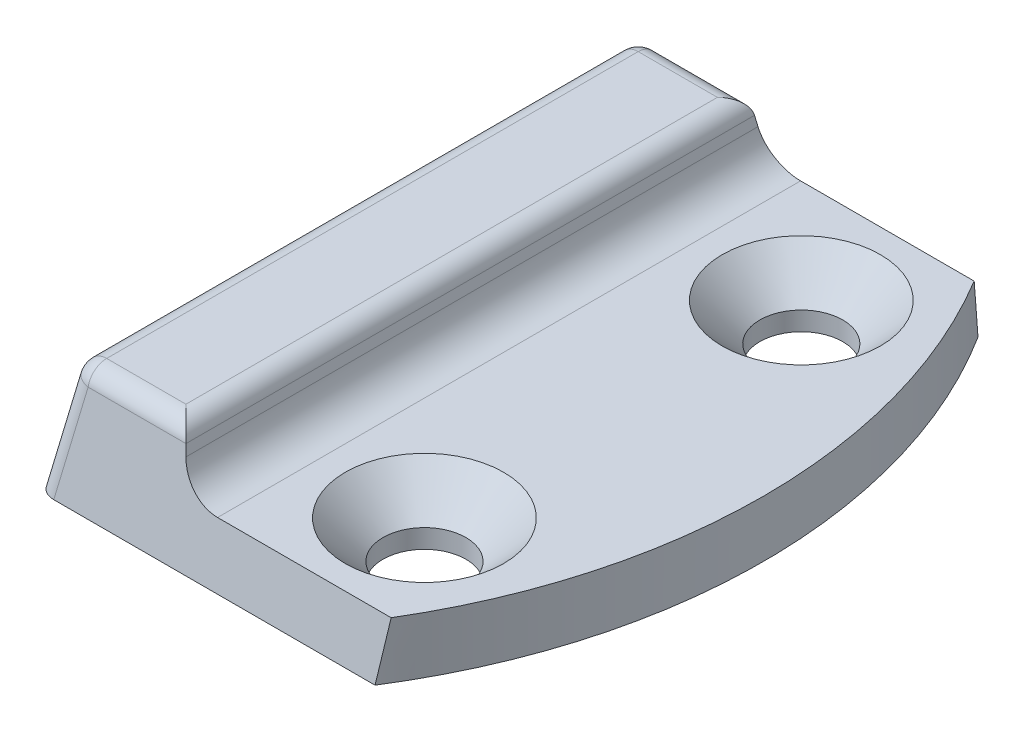
ISO-10303-21;
HEADER;
FILE_DESCRIPTION(('STEP AP214'),'2;1');
FILE_NAME('part.step','',(''),(''),'','','');
FILE_SCHEMA(('AUTOMOTIVE_DESIGN { 1 0 10303 214 1 1 1 1 }'));
ENDSEC;
DATA;
#1=APPLICATION_CONTEXT('core data for automotive mechanical design processes');
#2=APPLICATION_PROTOCOL_DEFINITION('international standard','automotive_design',2000,#1);
#3=PRODUCT_CONTEXT('',#1,'mechanical');
#4=PRODUCT('Part','Part','',(#3));
#5=PRODUCT_RELATED_PRODUCT_CATEGORY('part','',(#4));
#6=PRODUCT_DEFINITION_FORMATION('','',#4);
#7=PRODUCT_DEFINITION_CONTEXT('part definition',#1,'design');
#8=PRODUCT_DEFINITION('design','',#6,#7);
#9=PRODUCT_DEFINITION_SHAPE('','',#8);
#10=(LENGTH_UNIT() NAMED_UNIT(*) SI_UNIT(.MILLI.,.METRE.));
#11=(NAMED_UNIT(*) PLANE_ANGLE_UNIT() SI_UNIT($,.RADIAN.));
#12=(NAMED_UNIT(*) SI_UNIT($,.STERADIAN.) SOLID_ANGLE_UNIT());
#13=UNCERTAINTY_MEASURE_WITH_UNIT(LENGTH_MEASURE(1.E-05),#10,'distance_accuracy_value','');
#14=(GEOMETRIC_REPRESENTATION_CONTEXT(3) GLOBAL_UNCERTAINTY_ASSIGNED_CONTEXT((#13)) GLOBAL_UNIT_ASSIGNED_CONTEXT((#10,
#11,#12)) REPRESENTATION_CONTEXT('',''));
#15=CARTESIAN_POINT('',(0.,0.,0.));
#16=DIRECTION('',(0.,0.,1.));
#17=DIRECTION('',(1.,0.,0.));
#18=AXIS2_PLACEMENT_3D('',#15,#16,#17);
#19=CARTESIAN_POINT('',(7.67101905787461,1.5,-9.52313991782861));
#20=DIRECTION('',(0.,1.,0.));
#21=DIRECTION('',(0.,0.,1.));
#22=AXIS2_PLACEMENT_3D('',#19,#20,#21);
#23=PLANE('',#22);
#24=CARTESIAN_POINT('',(11.,1.5,5.));
#25=DIRECTION('',(0.,1.,0.));
#26=DIRECTION('',(0.,0.,1.));
#27=AXIS2_PLACEMENT_3D('',#24,#25,#26);
#28=CIRCLE('',#27,2.1);
#29=CARTESIAN_POINT('',(11.,1.5,7.1));
#30=VERTEX_POINT('',#29);
#31=EDGE_CURVE('E168',#30,#30,#28,.F.);
#32=ORIENTED_EDGE('',*,*,#31,.T.);
#33=EDGE_LOOP('',(#32));
#34=FACE_BOUND('',#33,.T.);
#35=CARTESIAN_POINT('',(11.,1.5,-5.));
#36=DIRECTION('',(0.,1.,0.));
#37=DIRECTION('',(0.,0.,1.));
#38=AXIS2_PLACEMENT_3D('',#35,#36,#37);
#39=CIRCLE('',#38,2.09999999999999);
#40=CARTESIAN_POINT('',(11.,1.5,-2.90000000000001));
#41=VERTEX_POINT('',#40);
#42=EDGE_CURVE('E165',#41,#41,#39,.F.);
#43=ORIENTED_EDGE('',*,*,#42,.T.);
#44=EDGE_LOOP('',(#43));
#45=FACE_BOUND('',#44,.T.);
#46=DIRECTION('',(-1.,0.,0.));
#47=VECTOR('',#46,1.);
#48=CARTESIAN_POINT('',(15.,1.5,-7.7355095289373));
#49=LINE('',#48,#47);
#50=CARTESIAN_POINT('',(12.8515326839922,1.5,-7.7355095289373));
#51=VERTEX_POINT('',#50);
#52=CARTESIAN_POINT('',(8.24562821798918,1.5,-7.7355095289373));
#53=VERTEX_POINT('',#52);
#54=EDGE_CURVE('E138',#51,#53,#49,.T.);
#55=ORIENTED_EDGE('',*,*,#54,.T.);
#56=DIRECTION('',(0.,0.,-1.));
#57=VECTOR('',#56,1.);
#58=CARTESIAN_POINT('',(8.24562821798918,1.5,-9.52313991782861));
#59=LINE('',#58,#57);
#60=CARTESIAN_POINT('',(8.24562821798919,1.5,7.7355095289373));
#61=VERTEX_POINT('',#60);
#62=EDGE_CURVE('E174',#53,#61,#59,.F.);
#63=ORIENTED_EDGE('',*,*,#62,.T.);
#64=DIRECTION('',(-1.,0.,0.));
#65=VECTOR('',#64,1.);
#66=CARTESIAN_POINT('',(15.,1.5,7.7355095289373));
#67=LINE('',#66,#65);
#68=CARTESIAN_POINT('',(12.8515326839922,1.5,7.7355095289373));
#69=VERTEX_POINT('',#68);
#70=EDGE_CURVE('E147',#69,#61,#67,.T.);
#71=ORIENTED_EDGE('',*,*,#70,.F.);
#72=CARTESIAN_POINT('',(0.,1.5,0.));
#73=DIRECTION('',(0.,1.,0.));
#74=DIRECTION('',(0.,0.,1.));
#75=AXIS2_PLACEMENT_3D('',#72,#73,#74);
#76=CIRCLE('',#75,15.);
#77=EDGE_CURVE('E132',#69,#51,#76,.T.);
#78=ORIENTED_EDGE('',*,*,#77,.T.);
#79=EDGE_LOOP('',(#55,#63,#71,#78));
#80=FACE_BOUND('',#79,.T.);
#81=ADVANCED_FACE('F39',(#34,#45,#80),#23,.T.);
#82=CARTESIAN_POINT('',(0.,1.5,0.));
#83=DIRECTION('',(0.,-1.,0.));
#84=DIRECTION('',(0.,0.,-1.));
#85=AXIS2_PLACEMENT_3D('',#82,#83,#84);
#86=CYLINDRICAL_SURFACE('',#85,15.);
#87=CARTESIAN_POINT('',(0.,45.3702545569409,0.));
#88=DIRECTION('',(0.,0.173648177666933,0.984807753012208));
#89=DIRECTION('',(0.,-0.984807753012208,0.173648177666933));
#90=AXIS2_PLACEMENT_3D('',#87,#88,#89);
#91=ELLIPSE('',#90,86.3815572471531,15.);
#92=CARTESIAN_POINT('',(12.6885775404495,0.,8.00000000000001));
#93=VERTEX_POINT('',#92);
#94=EDGE_CURVE('E142',#93,#69,#91,.T.);
#95=ORIENTED_EDGE('',*,*,#94,.F.);
#96=CARTESIAN_POINT('',(0.,0.,0.));
#97=DIRECTION('',(0.,1.,0.));
#98=DIRECTION('',(0.,0.,1.));
#99=AXIS2_PLACEMENT_3D('',#96,#97,#98);
#100=CIRCLE('',#99,15.);
#101=CARTESIAN_POINT('',(12.6885775404495,0.,-7.99999999999999));
#102=VERTEX_POINT('',#101);
#103=EDGE_CURVE('E127',#93,#102,#100,.T.);
#104=ORIENTED_EDGE('',*,*,#103,.T.);
#105=CARTESIAN_POINT('',(0.,45.3702545569415,0.));
#106=DIRECTION('',(0.,0.173648177666931,-0.984807753012208));
#107=DIRECTION('',(0.,-0.984807753012208,-0.173648177666931));
#108=AXIS2_PLACEMENT_3D('',#105,#106,#107);
#109=ELLIPSE('',#108,86.3815572471542,15.);
#110=EDGE_CURVE('E135',#51,#102,#109,.T.);
#111=ORIENTED_EDGE('',*,*,#110,.F.);
#112=ORIENTED_EDGE('',*,*,#77,.F.);
#113=EDGE_LOOP('',(#95,#104,#111,#112));
#114=FACE_BOUND('',#113,.T.);
#115=ADVANCED_FACE('F146',(#114),#86,.T.);
#116=CARTESIAN_POINT('',(7.6710190578746,0.,-7.99999999999999));
#117=DIRECTION('',(0.984807753012208,0.173648177666931,0.));
#118=DIRECTION('',(-0.173648177666931,0.984807753012208,0.));
#119=AXIS2_PLACEMENT_3D('',#116,#117,#118);
#120=PLANE('',#119);
#121=DIRECTION('',(0.171087869746036,-0.970287525247814,-0.171087869746036));
#122=VECTOR('',#121,1.);
#123=CARTESIAN_POINT('',(7.55393482117765,0.664017702943206,-7.88291576330305));
#124=LINE('',#123,#122);
#125=CARTESIAN_POINT('',(7.21489217666667,2.58682408883346,-7.54387311879206));
#126=VERTEX_POINT('',#125);
#127=CARTESIAN_POINT('',(7.26082046497697,2.32635182233307,-7.58980140710237));
#128=VERTEX_POINT('',#127);
#129=EDGE_CURVE('E143',#126,#128,#124,.T.);
#130=ORIENTED_EDGE('',*,*,#129,.F.);
#131=DIRECTION('',(0.,0.,-1.));
#132=VECTOR('',#131,1.);
#133=CARTESIAN_POINT('',(7.21489217666667,2.58682408883347,7.47101905787461));
#134=LINE('',#133,#132);
#135=CARTESIAN_POINT('',(7.21489217666667,2.58682408883347,7.54387311879207));
#136=VERTEX_POINT('',#135);
#137=EDGE_CURVE('E194',#126,#136,#134,.F.);
#138=ORIENTED_EDGE('',*,*,#137,.T.);
#139=DIRECTION('',(0.171087869746036,-0.970287525247814,0.171087869746036));
#140=VECTOR('',#139,1.);
#141=CARTESIAN_POINT('',(7.20268211108682,2.65607081177282,7.53166305321222));
#142=LINE('',#141,#140);
#143=CARTESIAN_POINT('',(7.26082046497698,2.32635182233307,7.58980140710238));
#144=VERTEX_POINT('',#143);
#145=EDGE_CURVE('E158',#136,#144,#142,.T.);
#146=ORIENTED_EDGE('',*,*,#145,.T.);
#147=DIRECTION('',(0.,0.,1.));
#148=VECTOR('',#147,1.);
#149=CARTESIAN_POINT('',(7.26082046497697,2.32635182233307,-7.99999999999999));
#150=LINE('',#149,#148);
#151=EDGE_CURVE('E177',#144,#128,#150,.F.);
#152=ORIENTED_EDGE('',*,*,#151,.T.);
#153=EDGE_LOOP('',(#130,#138,#146,#152));
#154=FACE_BOUND('',#153,.T.);
#155=ADVANCED_FACE('F279',(#154),#120,.T.);
#156=CARTESIAN_POINT('',(3.6710190578746,0.,-7.99999999999999));
#157=DIRECTION('',(0.,0.173648177666931,-0.984807753012208));
#158=DIRECTION('',(0.,0.984807753012208,0.173648177666931));
#159=AXIS2_PLACEMENT_3D('',#156,#157,#158);
#160=PLANE('',#159);
#161=DIRECTION('',(-1.,0.,0.));
#162=VECTOR('',#161,1.);
#163=CARTESIAN_POINT('',(3.6710190578746,0.,-7.99999999999999));
#164=LINE('',#163,#162);
#165=CARTESIAN_POINT('',(4.1634229343807,0.,-7.99999999999999));
#166=VERTEX_POINT('',#165);
#167=EDGE_CURVE('E122',#102,#166,#164,.T.);
#168=ORIENTED_EDGE('',*,*,#167,.T.);
#169=DIRECTION('',(0.171087869746036,0.970287525247814,0.171087869746036));
#170=VECTOR('',#169,1.);
#171=CARTESIAN_POINT('',(4.14900975137387,-0.0817412227494783,-8.01441318300683));
#172=LINE('',#171,#170);
#173=CARTESIAN_POINT('',(4.61954981558864,2.58682408883347,-7.54387311879206));
#174=VERTEX_POINT('',#173);
#175=EDGE_CURVE('E11',#166,#174,#172,.T.);
#176=ORIENTED_EDGE('',*,*,#175,.T.);
#177=DIRECTION('',(-1.,0.,0.));
#178=VECTOR('',#177,1.);
#179=CARTESIAN_POINT('',(7.14203811574921,2.58682408883347,-7.54387311879206));
#180=LINE('',#179,#178);
#181=EDGE_CURVE('E48',#174,#126,#180,.F.);
#182=ORIENTED_EDGE('',*,*,#181,.T.);
#183=ORIENTED_EDGE('',*,*,#129,.T.);
#184=CARTESIAN_POINT('',(8.24562821798918,2.5,-7.55918254822883));
#185=DIRECTION('',(0.,0.173648177666931,-0.984807753012208));
#186=DIRECTION('',(0.,-0.984807753012208,-0.173648177666931));
#187=AXIS2_PLACEMENT_3D('',#184,#185,#186);
#188=ELLIPSE('',#187,1.01542661188575,1.);
#189=EDGE_CURVE('E183',#128,#53,#188,.F.);
#190=ORIENTED_EDGE('',*,*,#189,.T.);
#191=ORIENTED_EDGE('',*,*,#54,.F.);
#192=ORIENTED_EDGE('',*,*,#110,.T.);
#193=EDGE_LOOP('',(#168,#176,#182,#183,#190,#191,#192));
#194=FACE_BOUND('',#193,.T.);
#195=ADVANCED_FACE('F136',(#194),#160,.T.);
#196=CARTESIAN_POINT('',(3.6710190578746,0.,-7.99999999999999));
#197=DIRECTION('',(-0.984807753012208,0.173648177666931,0.));
#198=DIRECTION('',(-0.173648177666931,-0.984807753012208,0.));
#199=AXIS2_PLACEMENT_3D('',#196,#197,#198);
#200=PLANE('',#199);
#201=DIRECTION('',(0.,0.,1.));
#202=VECTOR('',#201,1.);
#203=CARTESIAN_POINT('',(3.6710190578746,0.,-7.99999999999999));
#204=LINE('',#203,#202);
#205=CARTESIAN_POINT('',(3.6710190578746,0.,-7.50759612349389));
#206=VERTEX_POINT('',#205);
#207=CARTESIAN_POINT('',(3.67101905787461,0.,7.5075961234939));
#208=VERTEX_POINT('',#207);
#209=EDGE_CURVE('E131',#206,#208,#204,.T.);
#210=ORIENTED_EDGE('',*,*,#209,.T.);
#211=DIRECTION('',(0.171087869746036,0.970287525247814,-0.171087869746036));
#212=VECTOR('',#211,1.);
#213=CARTESIAN_POINT('',(4.12494282165556,2.57432958902334,7.05367235971295));
#214=LINE('',#213,#212);
#215=CARTESIAN_POINT('',(4.12714593908254,2.58682408883347,7.05146924228597));
#216=VERTEX_POINT('',#215);
#217=EDGE_CURVE('E207',#208,#216,#214,.T.);
#218=ORIENTED_EDGE('',*,*,#217,.T.);
#219=DIRECTION('',(0.,0.,1.));
#220=VECTOR('',#219,1.);
#221=CARTESIAN_POINT('',(4.12714593908253,2.58682408883347,-7.4710190578746));
#222=LINE('',#221,#220);
#223=CARTESIAN_POINT('',(4.12714593908253,2.58682408883347,-7.05146924228596));
#224=VERTEX_POINT('',#223);
#225=EDGE_CURVE('E62',#216,#224,#222,.F.);
#226=ORIENTED_EDGE('',*,*,#225,.T.);
#227=DIRECTION('',(0.171087869746036,0.970287525247814,0.171087869746036));
#228=VECTOR('',#227,1.);
#229=CARTESIAN_POINT('',(3.65660587486777,-0.0817412227494785,-7.52200930650072));
#230=LINE('',#229,#228);
#231=EDGE_CURVE('E205',#224,#206,#230,.F.);
#232=ORIENTED_EDGE('',*,*,#231,.T.);
#233=EDGE_LOOP('',(#210,#218,#226,#232));
#234=FACE_BOUND('',#233,.T.);
#235=ADVANCED_FACE('F254',(#234),#200,.T.);
#236=CARTESIAN_POINT('',(3.67101905787461,0.,8.00000000000001));
#237=DIRECTION('',(0.,0.173648177666931,0.984807753012208));
#238=DIRECTION('',(0.,-0.984807753012208,0.173648177666931));
#239=AXIS2_PLACEMENT_3D('',#236,#237,#238);
#240=PLANE('',#239);
#241=ORIENTED_EDGE('',*,*,#145,.F.);
#242=DIRECTION('',(1.,0.,0.));
#243=VECTOR('',#242,1.);
#244=CARTESIAN_POINT('',(4.2,2.58682408883347,7.54387311879207));
#245=LINE('',#244,#243);
#246=CARTESIAN_POINT('',(4.61954981558864,2.58682408883347,7.54387311879207));
#247=VERTEX_POINT('',#246);
#248=EDGE_CURVE('E199',#136,#247,#245,.F.);
#249=ORIENTED_EDGE('',*,*,#248,.T.);
#250=DIRECTION('',(0.171087869746036,0.970287525247814,-0.171087869746036));
#251=VECTOR('',#250,1.);
#252=CARTESIAN_POINT('',(4.14900975137388,-0.0817412227494782,8.01441318300684));
#253=LINE('',#252,#251);
#254=CARTESIAN_POINT('',(4.16342293438071,0.,8.00000000000001));
#255=VERTEX_POINT('',#254);
#256=EDGE_CURVE('E197',#247,#255,#253,.F.);
#257=ORIENTED_EDGE('',*,*,#256,.T.);
#258=DIRECTION('',(1.,0.,0.));
#259=VECTOR('',#258,1.);
#260=CARTESIAN_POINT('',(3.67101905787461,0.,8.00000000000001));
#261=LINE('',#260,#259);
#262=EDGE_CURVE('E156',#255,#93,#261,.T.);
#263=ORIENTED_EDGE('',*,*,#262,.T.);
#264=ORIENTED_EDGE('',*,*,#94,.T.);
#265=ORIENTED_EDGE('',*,*,#70,.T.);
#266=CARTESIAN_POINT('',(8.24562821798919,2.5,7.55918254822884));
#267=DIRECTION('',(0.,0.173648177666931,0.984807753012208));
#268=DIRECTION('',(0.,0.984807753012208,-0.173648177666931));
#269=AXIS2_PLACEMENT_3D('',#266,#267,#268);
#270=ELLIPSE('',#269,1.01542661188575,1.);
#271=EDGE_CURVE('E180',#61,#144,#270,.F.);
#272=ORIENTED_EDGE('',*,*,#271,.T.);
#273=EDGE_LOOP('',(#241,#249,#257,#263,#264,#265,#272));
#274=FACE_BOUND('',#273,.T.);
#275=ADVANCED_FACE('F249',(#274),#240,.T.);
#276=CARTESIAN_POINT('',(0.,3.,0.));
#277=DIRECTION('',(0.,1.,0.));
#278=DIRECTION('',(0.,0.,1.));
#279=AXIS2_PLACEMENT_3D('',#276,#277,#278);
#280=PLANE('',#279);
#281=DIRECTION('',(-1.,0.,0.));
#282=VECTOR('',#281,1.);
#283=CARTESIAN_POINT('',(7.14203811574921,3.,7.05146924228597));
#284=LINE('',#283,#282);
#285=CARTESIAN_POINT('',(4.61954981558864,3.,7.05146924228597));
#286=VERTEX_POINT('',#285);
#287=CARTESIAN_POINT('',(6.72248830016057,3.,7.05146924228597));
#288=VERTEX_POINT('',#287);
#289=EDGE_CURVE('E189',#286,#288,#284,.F.);
#290=ORIENTED_EDGE('',*,*,#289,.T.);
#291=DIRECTION('',(0.,0.,1.));
#292=VECTOR('',#291,1.);
#293=CARTESIAN_POINT('',(6.72248830016057,3.,-7.4710190578746));
#294=LINE('',#293,#292);
#295=CARTESIAN_POINT('',(6.72248830016057,3.,-7.05146924228596));
#296=VERTEX_POINT('',#295);
#297=EDGE_CURVE('E191',#288,#296,#294,.F.);
#298=ORIENTED_EDGE('',*,*,#297,.T.);
#299=DIRECTION('',(1.,0.,0.));
#300=VECTOR('',#299,1.);
#301=CARTESIAN_POINT('',(4.2,3.,-7.05146924228596));
#302=LINE('',#301,#300);
#303=CARTESIAN_POINT('',(4.61954981558864,3.,-7.05146924228596));
#304=VERTEX_POINT('',#303);
#305=EDGE_CURVE('E185',#296,#304,#302,.F.);
#306=ORIENTED_EDGE('',*,*,#305,.T.);
#307=DIRECTION('',(0.,0.,-1.));
#308=VECTOR('',#307,1.);
#309=CARTESIAN_POINT('',(4.61954981558864,3.,7.47101905787461));
#310=LINE('',#309,#308);
#311=EDGE_CURVE('E187',#304,#286,#310,.F.);
#312=ORIENTED_EDGE('',*,*,#311,.T.);
#313=EDGE_LOOP('',(#290,#298,#306,#312));
#314=FACE_BOUND('',#313,.T.);
#315=ADVANCED_FACE('F284',(#314),#280,.T.);
#316=CARTESIAN_POINT('',(0.,0.,0.));
#317=DIRECTION('',(0.,1.,0.));
#318=DIRECTION('',(0.,0.,1.));
#319=AXIS2_PLACEMENT_3D('',#316,#317,#318);
#320=PLANE('',#319);
#321=CARTESIAN_POINT('',(11.,0.,-5.));
#322=DIRECTION('',(0.,1.,0.));
#323=DIRECTION('',(-1.,0.,0.));
#324=AXIS2_PLACEMENT_3D('',#321,#322,#323);
#325=CIRCLE('',#324,1.1);
#326=CARTESIAN_POINT('',(9.89999999999999,0.,-5.));
#327=VERTEX_POINT('',#326);
#328=EDGE_CURVE('E234',#327,#327,#325,.T.);
#329=ORIENTED_EDGE('',*,*,#328,.T.);
#330=EDGE_LOOP('',(#329));
#331=FACE_BOUND('',#330,.T.);
#332=CARTESIAN_POINT('',(11.,0.,5.));
#333=DIRECTION('',(0.,1.,0.));
#334=DIRECTION('',(-1.,0.,0.));
#335=AXIS2_PLACEMENT_3D('',#332,#333,#334);
#336=CIRCLE('',#335,1.1);
#337=CARTESIAN_POINT('',(9.9,0.,5.));
#338=VERTEX_POINT('',#337);
#339=EDGE_CURVE('E231',#338,#338,#336,.T.);
#340=ORIENTED_EDGE('',*,*,#339,.T.);
#341=EDGE_LOOP('',(#340));
#342=FACE_BOUND('',#341,.T.);
#343=ORIENTED_EDGE('',*,*,#262,.F.);
#344=CARTESIAN_POINT('',(4.17873236381748,0.,7.49228669405713));
#345=DIRECTION('',(0.,1.,0.));
#346=DIRECTION('',(-0.707106781186547,0.,0.707106781186548));
#347=AXIS2_PLACEMENT_3D('',#344,#345,#346);
#348=ELLIPSE('',#347,0.515311170132069,0.5);
#349=EDGE_CURVE('E202',#255,#208,#348,.F.);
#350=ORIENTED_EDGE('',*,*,#349,.T.);
#351=ORIENTED_EDGE('',*,*,#209,.F.);
#352=CARTESIAN_POINT('',(4.17873236381747,0.,-7.49228669405712));
#353=DIRECTION('',(0.,1.,0.));
#354=DIRECTION('',(-0.707106781186548,0.,-0.707106781186547));
#355=AXIS2_PLACEMENT_3D('',#352,#353,#354);
#356=ELLIPSE('',#355,0.515311170132069,0.5);
#357=EDGE_CURVE('E130',#206,#166,#356,.F.);
#358=ORIENTED_EDGE('',*,*,#357,.T.);
#359=ORIENTED_EDGE('',*,*,#167,.F.);
#360=ORIENTED_EDGE('',*,*,#103,.F.);
#361=EDGE_LOOP('',(#343,#350,#351,#358,#359,#360));
#362=FACE_BOUND('',#361,.T.);
#363=ADVANCED_FACE('F125',(#331,#342,#362),#320,.F.);
#364=CARTESIAN_POINT('',(11.,0.,5.));
#365=DIRECTION('',(0.,1.,0.));
#366=DIRECTION('',(-1.,0.,0.));
#367=AXIS2_PLACEMENT_3D('',#364,#365,#366);
#368=CYLINDRICAL_SURFACE('',#367,1.1);
#369=CARTESIAN_POINT('',(11.,0.500000000000014,5.));
#370=DIRECTION('',(0.,1.,0.));
#371=DIRECTION('',(-1.,0.,0.));
#372=AXIS2_PLACEMENT_3D('',#369,#370,#371);
#373=CIRCLE('',#372,1.1);
#374=CARTESIAN_POINT('',(9.9,0.500000000000012,5.));
#375=VERTEX_POINT('',#374);
#376=EDGE_CURVE('E162',#375,#375,#373,.T.);
#377=ORIENTED_EDGE('',*,*,#376,.T.);
#378=EDGE_LOOP('',(#377));
#379=FACE_BOUND('',#378,.T.);
#380=ORIENTED_EDGE('',*,*,#339,.F.);
#381=EDGE_LOOP('',(#380));
#382=FACE_BOUND('',#381,.T.);
#383=ADVANCED_FACE('F290',(#379,#382),#368,.F.);
#384=CARTESIAN_POINT('',(11.,0.,-5.));
#385=DIRECTION('',(0.,1.,0.));
#386=DIRECTION('',(-1.,0.,0.));
#387=AXIS2_PLACEMENT_3D('',#384,#385,#386);
#388=CYLINDRICAL_SURFACE('',#387,1.1);
#389=CARTESIAN_POINT('',(11.,0.500000000000025,-5.));
#390=DIRECTION('',(0.,1.,0.));
#391=DIRECTION('',(-1.,0.,0.));
#392=AXIS2_PLACEMENT_3D('',#389,#390,#391);
#393=CIRCLE('',#392,1.1);
#394=CARTESIAN_POINT('',(9.89999999999999,0.500000000000023,-5.));
#395=VERTEX_POINT('',#394);
#396=EDGE_CURVE('E171',#395,#395,#393,.T.);
#397=ORIENTED_EDGE('',*,*,#396,.T.);
#398=EDGE_LOOP('',(#397));
#399=FACE_BOUND('',#398,.T.);
#400=ORIENTED_EDGE('',*,*,#328,.F.);
#401=EDGE_LOOP('',(#400));
#402=FACE_BOUND('',#401,.T.);
#403=ADVANCED_FACE('F309',(#399,#402),#388,.F.);
#404=CARTESIAN_POINT('',(11.,0.500000000000013,5.));
#405=DIRECTION('',(0.,1.,0.));
#406=DIRECTION('',(-1.,0.,0.));
#407=AXIS2_PLACEMENT_3D('',#404,#405,#406);
#408=CONICAL_SURFACE('',#407,1.1,0.785398163397451);
#409=ORIENTED_EDGE('',*,*,#31,.F.);
#410=EDGE_LOOP('',(#409));
#411=FACE_BOUND('',#410,.T.);
#412=ORIENTED_EDGE('',*,*,#376,.F.);
#413=EDGE_LOOP('',(#412));
#414=FACE_BOUND('',#413,.T.);
#415=ADVANCED_FACE('F302',(#411,#414),#408,.F.);
#416=CARTESIAN_POINT('',(11.,0.500000000000024,-5.));
#417=DIRECTION('',(0.,1.,0.));
#418=DIRECTION('',(-1.,0.,0.));
#419=AXIS2_PLACEMENT_3D('',#416,#417,#418);
#420=CONICAL_SURFACE('',#419,1.1,0.785398163397451);
#421=ORIENTED_EDGE('',*,*,#42,.F.);
#422=EDGE_LOOP('',(#421));
#423=FACE_BOUND('',#422,.T.);
#424=ORIENTED_EDGE('',*,*,#396,.F.);
#425=EDGE_LOOP('',(#424));
#426=FACE_BOUND('',#425,.T.);
#427=ADVANCED_FACE('F308',(#423,#426),#420,.F.);
#428=CARTESIAN_POINT('',(8.24562821798918,2.5,-9.52313991782861));
#429=DIRECTION('',(0.,0.,-1.));
#430=DIRECTION('',(-1.,0.,0.));
#431=AXIS2_PLACEMENT_3D('',#428,#429,#430);
#432=CYLINDRICAL_SURFACE('',#431,1.);
#433=ORIENTED_EDGE('',*,*,#189,.F.);
#434=ORIENTED_EDGE('',*,*,#151,.F.);
#435=ORIENTED_EDGE('',*,*,#271,.F.);
#436=ORIENTED_EDGE('',*,*,#62,.F.);
#437=EDGE_LOOP('',(#433,#434,#435,#436));
#438=FACE_BOUND('',#437,.T.);
#439=ADVANCED_FACE('F245',(#438),#432,.F.);
#440=CARTESIAN_POINT('',(4.14900975137388,-0.168565311582944,7.52200930650073));
#441=DIRECTION('',(-0.171087869746036,-0.970287525247814,0.171087869746036));
#442=DIRECTION('',(0.,-0.173648177666931,-0.984807753012208));
#443=AXIS2_PLACEMENT_3D('',#440,#441,#442);
#444=CYLINDRICAL_SURFACE('',#443,0.5);
#445=ORIENTED_EDGE('',*,*,#349,.F.);
#446=ORIENTED_EDGE('',*,*,#256,.F.);
#447=CARTESIAN_POINT('',(4.61954981558864,2.5,7.05146924228597));
#448=DIRECTION('',(0.171087869746036,0.970287525247814,-0.171087869746035));
#449=DIRECTION('',(-0.984807753012208,0.173648177666931,0.));
#450=AXIS2_PLACEMENT_3D('',#447,#448,#449);
#451=CIRCLE('',#450,0.5);
#452=EDGE_CURVE('E43',#216,#247,#451,.T.);
#453=ORIENTED_EDGE('',*,*,#452,.F.);
#454=ORIENTED_EDGE('',*,*,#217,.F.);
#455=EDGE_LOOP('',(#445,#446,#453,#454));
#456=FACE_BOUND('',#455,.T.);
#457=ADVANCED_FACE('F41',(#456),#444,.T.);
#458=CARTESIAN_POINT('',(4.61954981558864,2.5,0.));
#459=DIRECTION('',(0.,0.,1.));
#460=DIRECTION('',(1.,0.,0.));
#461=AXIS2_PLACEMENT_3D('',#458,#459,#460);
#462=CYLINDRICAL_SURFACE('',#461,0.5);
#463=CARTESIAN_POINT('',(4.61954981558864,2.5,-7.05146924228596));
#464=DIRECTION('',(0.,0.,-1.));
#465=DIRECTION('',(-1.,0.,0.));
#466=AXIS2_PLACEMENT_3D('',#463,#464,#465);
#467=CIRCLE('',#466,0.5);
#468=EDGE_CURVE('E223',#224,#304,#467,.T.);
#469=ORIENTED_EDGE('',*,*,#468,.F.);
#470=ORIENTED_EDGE('',*,*,#225,.F.);
#471=CARTESIAN_POINT('',(4.61954981558864,2.5,7.05146924228597));
#472=DIRECTION('',(0.,0.,1.));
#473=DIRECTION('',(1.,0.,0.));
#474=AXIS2_PLACEMENT_3D('',#471,#472,#473);
#475=CIRCLE('',#474,0.5);
#476=EDGE_CURVE('E225',#286,#216,#475,.T.);
#477=ORIENTED_EDGE('',*,*,#476,.F.);
#478=ORIENTED_EDGE('',*,*,#311,.F.);
#479=EDGE_LOOP('',(#469,#470,#477,#478));
#480=FACE_BOUND('',#479,.T.);
#481=ADVANCED_FACE('F257',(#480),#462,.T.);
#482=CARTESIAN_POINT('',(4.14900975137387,-0.168565311582944,-7.52200930650072));
#483=DIRECTION('',(-0.171087869746036,-0.970287525247814,-0.171087869746036));
#484=DIRECTION('',(0.984807753012208,-0.173648177666931,0.));
#485=AXIS2_PLACEMENT_3D('',#482,#483,#484);
#486=CYLINDRICAL_SURFACE('',#485,0.5);
#487=ORIENTED_EDGE('',*,*,#357,.F.);
#488=ORIENTED_EDGE('',*,*,#231,.F.);
#489=CARTESIAN_POINT('',(4.61954981558864,2.5,-7.05146924228596));
#490=DIRECTION('',(0.171087869746037,0.970287525247814,0.171087869746036));
#491=DIRECTION('',(-0.984807753012208,0.173648177666932,0.));
#492=AXIS2_PLACEMENT_3D('',#489,#490,#491);
#493=CIRCLE('',#492,0.5);
#494=EDGE_CURVE('E220',#174,#224,#493,.T.);
#495=ORIENTED_EDGE('',*,*,#494,.F.);
#496=ORIENTED_EDGE('',*,*,#175,.F.);
#497=EDGE_LOOP('',(#487,#488,#495,#496));
#498=FACE_BOUND('',#497,.T.);
#499=ADVANCED_FACE('F264',(#498),#486,.T.);
#500=CARTESIAN_POINT('',(4.61954981558864,2.5,7.05146924228597));
#501=DIRECTION('',(0.,0.,1.));
#502=DIRECTION('',(1.,0.,0.));
#503=AXIS2_PLACEMENT_3D('',#500,#501,#502);
#504=SPHERICAL_SURFACE('',#503,0.5);
#505=ORIENTED_EDGE('',*,*,#476,.T.);
#506=ORIENTED_EDGE('',*,*,#452,.T.);
#507=CARTESIAN_POINT('',(4.61954981558864,2.5,7.05146924228597));
#508=DIRECTION('',(-1.,0.,0.));
#509=DIRECTION('',(0.,0.,1.));
#510=AXIS2_PLACEMENT_3D('',#507,#508,#509);
#511=CIRCLE('',#510,0.5);
#512=EDGE_CURVE('E217',#286,#247,#511,.F.);
#513=ORIENTED_EDGE('',*,*,#512,.F.);
#514=EDGE_LOOP('',(#505,#506,#513));
#515=FACE_BOUND('',#514,.T.);
#516=ADVANCED_FACE('F266',(#515),#504,.T.);
#517=CARTESIAN_POINT('',(4.61954981558864,2.5,-7.05146924228596));
#518=DIRECTION('',(0.,0.,1.));
#519=DIRECTION('',(1.,0.,0.));
#520=AXIS2_PLACEMENT_3D('',#517,#518,#519);
#521=SPHERICAL_SURFACE('',#520,0.5);
#522=ORIENTED_EDGE('',*,*,#494,.T.);
#523=ORIENTED_EDGE('',*,*,#468,.T.);
#524=CARTESIAN_POINT('',(4.61954981558864,2.5,-7.05146924228596));
#525=DIRECTION('',(-1.,0.,0.));
#526=DIRECTION('',(0.,0.,1.));
#527=AXIS2_PLACEMENT_3D('',#524,#525,#526);
#528=CIRCLE('',#527,0.5);
#529=EDGE_CURVE('E214',#174,#304,#528,.F.);
#530=ORIENTED_EDGE('',*,*,#529,.F.);
#531=EDGE_LOOP('',(#522,#523,#530));
#532=FACE_BOUND('',#531,.T.);
#533=ADVANCED_FACE('F261',(#532),#521,.T.);
#534=CARTESIAN_POINT('',(0.,2.5,7.05146924228597));
#535=DIRECTION('',(1.,0.,0.));
#536=DIRECTION('',(0.,0.,-1.));
#537=AXIS2_PLACEMENT_3D('',#534,#535,#536);
#538=CYLINDRICAL_SURFACE('',#537,0.5);
#539=ORIENTED_EDGE('',*,*,#512,.T.);
#540=ORIENTED_EDGE('',*,*,#248,.F.);
#541=CARTESIAN_POINT('',(6.72248830016057,2.5,7.05146924228597));
#542=DIRECTION('',(0.707106781186547,0.,-0.707106781186548));
#543=DIRECTION('',(0.707106781186548,0.,0.707106781186547));
#544=AXIS2_PLACEMENT_3D('',#541,#542,#543);
#545=ELLIPSE('',#544,0.707106781186548,0.5);
#546=EDGE_CURVE('E212',#288,#136,#545,.T.);
#547=ORIENTED_EDGE('',*,*,#546,.F.);
#548=ORIENTED_EDGE('',*,*,#289,.F.);
#549=EDGE_LOOP('',(#539,#540,#547,#548));
#550=FACE_BOUND('',#549,.T.);
#551=ADVANCED_FACE('F325',(#550),#538,.T.);
#552=CARTESIAN_POINT('',(0.,2.5,-7.05146924228596));
#553=DIRECTION('',(-1.,0.,0.));
#554=DIRECTION('',(0.,0.,1.));
#555=AXIS2_PLACEMENT_3D('',#552,#553,#554);
#556=CYLINDRICAL_SURFACE('',#555,0.5);
#557=ORIENTED_EDGE('',*,*,#529,.T.);
#558=ORIENTED_EDGE('',*,*,#305,.F.);
#559=CARTESIAN_POINT('',(6.72248830016057,2.5,-7.05146924228596));
#560=DIRECTION('',(-0.707106781186548,0.,-0.707106781186547));
#561=DIRECTION('',(-0.707106781186547,0.,0.707106781186548));
#562=AXIS2_PLACEMENT_3D('',#559,#560,#561);
#563=ELLIPSE('',#562,0.707106781186547,0.5);
#564=EDGE_CURVE('E210',#126,#296,#563,.F.);
#565=ORIENTED_EDGE('',*,*,#564,.F.);
#566=ORIENTED_EDGE('',*,*,#181,.F.);
#567=EDGE_LOOP('',(#557,#558,#565,#566));
#568=FACE_BOUND('',#567,.T.);
#569=ADVANCED_FACE('F321',(#568),#556,.T.);
#570=CARTESIAN_POINT('',(6.72248830016057,2.5,0.));
#571=DIRECTION('',(0.,0.,-1.));
#572=DIRECTION('',(-1.,0.,0.));
#573=AXIS2_PLACEMENT_3D('',#570,#571,#572);
#574=CYLINDRICAL_SURFACE('',#573,0.5);
#575=ORIENTED_EDGE('',*,*,#546,.T.);
#576=ORIENTED_EDGE('',*,*,#137,.F.);
#577=ORIENTED_EDGE('',*,*,#564,.T.);
#578=ORIENTED_EDGE('',*,*,#297,.F.);
#579=EDGE_LOOP('',(#575,#576,#577,#578));
#580=FACE_BOUND('',#579,.T.);
#581=ADVANCED_FACE('F318',(#580),#574,.T.);
#582=CLOSED_SHELL('',(#81,#115,#155,#195,#235,#275,#315,#363,#383,#403,#415,#427,#439,#457,#481,
#499,#516,#533,#551,#569,#581));
#583=MANIFOLD_SOLID_BREP('B2',#582);
#584=ADVANCED_BREP_SHAPE_REPRESENTATION('',(#18,#583),#14);
#585=SHAPE_DEFINITION_REPRESENTATION(#9,#584);
ENDSEC;
END-ISO-10303-21;
